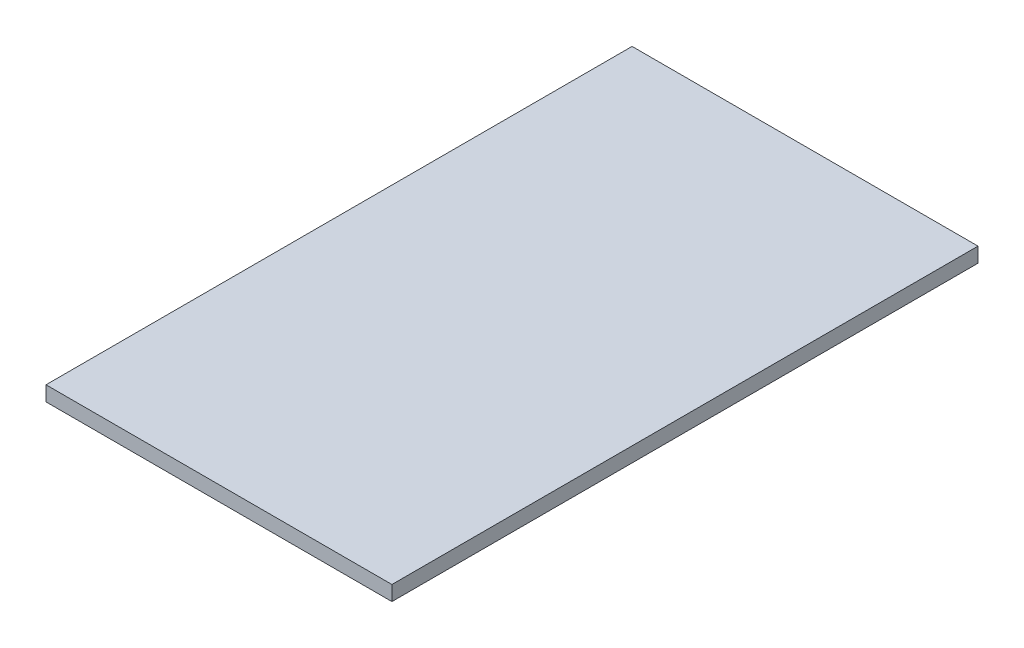
ISO-10303-21;
HEADER;
FILE_DESCRIPTION(('STEP AP214'),'2;1');
FILE_NAME('part.step','',(''),(''),'','','');
FILE_SCHEMA(('AUTOMOTIVE_DESIGN { 1 0 10303 214 1 1 1 1 }'));
ENDSEC;
DATA;
#1=APPLICATION_CONTEXT('core data for automotive mechanical design processes');
#2=APPLICATION_PROTOCOL_DEFINITION('international standard','automotive_design',2000,#1);
#3=PRODUCT_CONTEXT('',#1,'mechanical');
#4=PRODUCT('Part','Part','',(#3));
#5=PRODUCT_RELATED_PRODUCT_CATEGORY('part','',(#4));
#6=PRODUCT_DEFINITION_FORMATION('','',#4);
#7=PRODUCT_DEFINITION_CONTEXT('part definition',#1,'design');
#8=PRODUCT_DEFINITION('design','',#6,#7);
#9=PRODUCT_DEFINITION_SHAPE('','',#8);
#10=(LENGTH_UNIT() NAMED_UNIT(*) SI_UNIT(.MILLI.,.METRE.));
#11=(NAMED_UNIT(*) PLANE_ANGLE_UNIT() SI_UNIT($,.RADIAN.));
#12=(NAMED_UNIT(*) SI_UNIT($,.STERADIAN.) SOLID_ANGLE_UNIT());
#13=UNCERTAINTY_MEASURE_WITH_UNIT(LENGTH_MEASURE(1.E-05),#10,'distance_accuracy_value','');
#14=(GEOMETRIC_REPRESENTATION_CONTEXT(3) GLOBAL_UNCERTAINTY_ASSIGNED_CONTEXT((#13)) GLOBAL_UNIT_ASSIGNED_CONTEXT((#10,
#11,#12)) REPRESENTATION_CONTEXT('',''));
#15=CARTESIAN_POINT('',(0.,0.,0.));
#16=DIRECTION('',(0.,0.,1.));
#17=DIRECTION('',(1.,0.,0.));
#18=AXIS2_PLACEMENT_3D('',#15,#16,#17);
#19=CARTESIAN_POINT('',(50.,3.,0.));
#20=DIRECTION('',(1.,0.,0.));
#21=DIRECTION('',(0.,0.,-1.));
#22=AXIS2_PLACEMENT_3D('',#19,#20,#21);
#23=PLANE('',#22);
#24=DIRECTION('',(0.,0.,1.));
#25=VECTOR('',#24,1.);
#26=CARTESIAN_POINT('',(50.,0.,0.));
#27=LINE('',#26,#25);
#28=CARTESIAN_POINT('',(50.,0.,75.0000020600337));
#29=VERTEX_POINT('',#28);
#30=CARTESIAN_POINT('',(50.,0.,193.6));
#31=VERTEX_POINT('',#30);
#32=EDGE_CURVE('E76',#29,#31,#27,.T.);
#33=ORIENTED_EDGE('',*,*,#32,.F.);
#34=DIRECTION('',(0.,1.,0.));
#35=VECTOR('',#34,1.);
#36=CARTESIAN_POINT('',(50.,-7.,75.0000020600337));
#37=LINE('',#36,#35);
#38=CARTESIAN_POINT('',(50.,3.,75.0000020600337));
#39=VERTEX_POINT('',#38);
#40=EDGE_CURVE('E54',#29,#39,#37,.T.);
#41=ORIENTED_EDGE('',*,*,#40,.T.);
#42=DIRECTION('',(0.,0.,1.));
#43=VECTOR('',#42,1.);
#44=CARTESIAN_POINT('',(50.,3.,0.));
#45=LINE('',#44,#43);
#46=CARTESIAN_POINT('',(50.,3.,193.6));
#47=VERTEX_POINT('',#46);
#48=EDGE_CURVE('E62',#39,#47,#45,.T.);
#49=ORIENTED_EDGE('',*,*,#48,.T.);
#50=DIRECTION('',(0.,-1.,0.));
#51=VECTOR('',#50,1.);
#52=CARTESIAN_POINT('',(50.,3.,193.6));
#53=LINE('',#52,#51);
#54=EDGE_CURVE('E85',#47,#31,#53,.T.);
#55=ORIENTED_EDGE('',*,*,#54,.T.);
#56=EDGE_LOOP('',(#33,#41,#49,#55));
#57=FACE_BOUND('',#56,.T.);
#58=ADVANCED_FACE('F41',(#57),#23,.T.);
#59=CARTESIAN_POINT('',(-20.,3.,0.));
#60=DIRECTION('',(1.,0.,0.));
#61=DIRECTION('',(0.,0.,-1.));
#62=AXIS2_PLACEMENT_3D('',#59,#60,#61);
#63=PLANE('',#62);
#64=DIRECTION('',(0.,1.,0.));
#65=VECTOR('',#64,1.);
#66=CARTESIAN_POINT('',(-20.,-7.,75.0000020600337));
#67=LINE('',#66,#65);
#68=CARTESIAN_POINT('',(-20.,0.,75.0000020600337));
#69=VERTEX_POINT('',#68);
#70=CARTESIAN_POINT('',(-20.,3.,75.0000020600337));
#71=VERTEX_POINT('',#70);
#72=EDGE_CURVE('E82',#69,#71,#67,.T.);
#73=ORIENTED_EDGE('',*,*,#72,.F.);
#74=DIRECTION('',(0.,0.,1.));
#75=VECTOR('',#74,1.);
#76=CARTESIAN_POINT('',(-20.,0.,0.));
#77=LINE('',#76,#75);
#78=CARTESIAN_POINT('',(-20.,0.,193.6));
#79=VERTEX_POINT('',#78);
#80=EDGE_CURVE('E81',#69,#79,#77,.T.);
#81=ORIENTED_EDGE('',*,*,#80,.T.);
#82=DIRECTION('',(0.,-1.,0.));
#83=VECTOR('',#82,1.);
#84=CARTESIAN_POINT('',(-20.,3.,193.6));
#85=LINE('',#84,#83);
#86=CARTESIAN_POINT('',(-20.,3.,193.6));
#87=VERTEX_POINT('',#86);
#88=EDGE_CURVE('E48',#87,#79,#85,.T.);
#89=ORIENTED_EDGE('',*,*,#88,.F.);
#90=DIRECTION('',(0.,0.,1.));
#91=VECTOR('',#90,1.);
#92=CARTESIAN_POINT('',(-20.,3.,0.));
#93=LINE('',#92,#91);
#94=EDGE_CURVE('E94',#71,#87,#93,.T.);
#95=ORIENTED_EDGE('',*,*,#94,.F.);
#96=EDGE_LOOP('',(#73,#81,#89,#95));
#97=FACE_BOUND('',#96,.T.);
#98=ADVANCED_FACE('F113',(#97),#63,.F.);
#99=CARTESIAN_POINT('',(0.,3.,0.));
#100=DIRECTION('',(0.,1.,0.));
#101=DIRECTION('',(0.,0.,1.));
#102=AXIS2_PLACEMENT_3D('',#99,#100,#101);
#103=PLANE('',#102);
#104=ORIENTED_EDGE('',*,*,#48,.F.);
#105=DIRECTION('',(-1.,0.,-8.67163483876863E-13));
#106=VECTOR('',#105,1.);
#107=CARTESIAN_POINT('',(-6.50372630771395E-11,3.,75.0000020600207));
#108=LINE('',#107,#106);
#109=EDGE_CURVE('E101',#39,#71,#108,.T.);
#110=ORIENTED_EDGE('',*,*,#109,.T.);
#111=ORIENTED_EDGE('',*,*,#94,.T.);
#112=DIRECTION('',(1.,0.,0.));
#113=VECTOR('',#112,1.);
#114=CARTESIAN_POINT('',(-1.53527983976736E-13,3.,193.6));
#115=LINE('',#114,#113);
#116=EDGE_CURVE('E88',#87,#47,#115,.T.);
#117=ORIENTED_EDGE('',*,*,#116,.T.);
#118=EDGE_LOOP('',(#104,#110,#111,#117));
#119=FACE_BOUND('',#118,.T.);
#120=ADVANCED_FACE('F108',(#119),#103,.T.);
#121=CARTESIAN_POINT('',(0.,0.,0.));
#122=DIRECTION('',(0.,1.,0.));
#123=DIRECTION('',(0.,0.,1.));
#124=AXIS2_PLACEMENT_3D('',#121,#122,#123);
#125=PLANE('',#124);
#126=DIRECTION('',(-1.,0.,-8.67163483876863E-13));
#127=VECTOR('',#126,1.);
#128=CARTESIAN_POINT('',(-6.50372630771395E-11,0.,75.0000020600207));
#129=LINE('',#128,#127);
#130=EDGE_CURVE('E11',#29,#69,#129,.T.);
#131=ORIENTED_EDGE('',*,*,#130,.F.);
#132=ORIENTED_EDGE('',*,*,#32,.T.);
#133=DIRECTION('',(1.,0.,0.));
#134=VECTOR('',#133,1.);
#135=CARTESIAN_POINT('',(-1.53527983976736E-13,0.,193.6));
#136=LINE('',#135,#134);
#137=EDGE_CURVE('E80',#79,#31,#136,.T.);
#138=ORIENTED_EDGE('',*,*,#137,.F.);
#139=ORIENTED_EDGE('',*,*,#80,.F.);
#140=EDGE_LOOP('',(#131,#132,#138,#139));
#141=FACE_BOUND('',#140,.T.);
#142=ADVANCED_FACE('F77',(#141),#125,.F.);
#143=CARTESIAN_POINT('',(-1.53527983976736E-13,3.,193.6));
#144=DIRECTION('',(0.,0.,-1.));
#145=DIRECTION('',(-1.,0.,0.));
#146=AXIS2_PLACEMENT_3D('',#143,#144,#145);
#147=PLANE('',#146);
#148=ORIENTED_EDGE('',*,*,#137,.T.);
#149=ORIENTED_EDGE('',*,*,#54,.F.);
#150=ORIENTED_EDGE('',*,*,#116,.F.);
#151=ORIENTED_EDGE('',*,*,#88,.T.);
#152=EDGE_LOOP('',(#148,#149,#150,#151));
#153=FACE_BOUND('',#152,.T.);
#154=ADVANCED_FACE('F91',(#153),#147,.F.);
#155=CARTESIAN_POINT('',(-6.50372630771395E-11,-7.,75.0000020600207));
#156=DIRECTION('',(8.67163483876863E-13,0.,-1.));
#157=DIRECTION('',(-1.,0.,-8.67163483876863E-13));
#158=AXIS2_PLACEMENT_3D('',#155,#156,#157);
#159=PLANE('',#158);
#160=ORIENTED_EDGE('',*,*,#130,.T.);
#161=ORIENTED_EDGE('',*,*,#72,.T.);
#162=ORIENTED_EDGE('',*,*,#109,.F.);
#163=ORIENTED_EDGE('',*,*,#40,.F.);
#164=EDGE_LOOP('',(#160,#161,#162,#163));
#165=FACE_BOUND('',#164,.T.);
#166=ADVANCED_FACE('F115',(#165),#159,.T.);
#167=CLOSED_SHELL('',(#58,#98,#120,#142,#154,#166));
#168=MANIFOLD_SOLID_BREP('B2',#167);
#169=ADVANCED_BREP_SHAPE_REPRESENTATION('',(#18,#168),#14);
#170=SHAPE_DEFINITION_REPRESENTATION(#9,#169);
ENDSEC;
END-ISO-10303-21;
